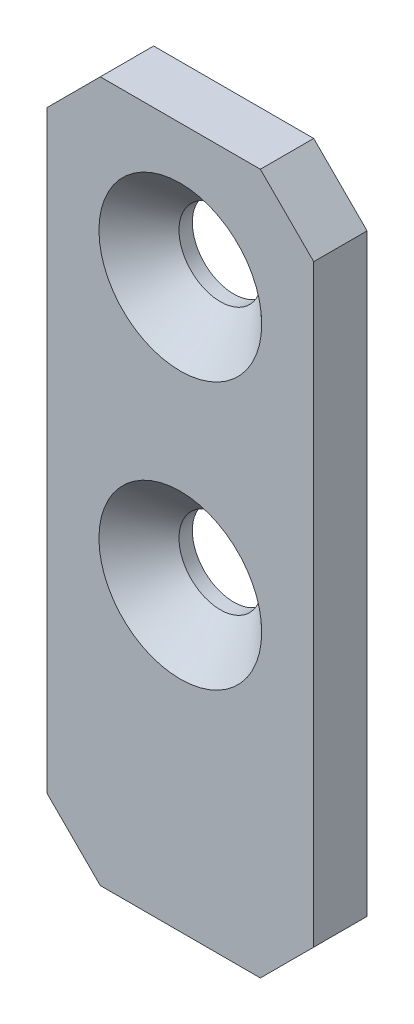
ISO-10303-21;
HEADER;
FILE_DESCRIPTION(('STEP AP214'),'2;1');
FILE_NAME('part.step','',(''),(''),'','','');
FILE_SCHEMA(('AUTOMOTIVE_DESIGN { 1 0 10303 214 1 1 1 1 }'));
ENDSEC;
DATA;
#1=APPLICATION_CONTEXT('core data for automotive mechanical design processes');
#2=APPLICATION_PROTOCOL_DEFINITION('international standard','automotive_design',2000,#1);
#3=PRODUCT_CONTEXT('',#1,'mechanical');
#4=PRODUCT('Part','Part','',(#3));
#5=PRODUCT_RELATED_PRODUCT_CATEGORY('part','',(#4));
#6=PRODUCT_DEFINITION_FORMATION('','',#4);
#7=PRODUCT_DEFINITION_CONTEXT('part definition',#1,'design');
#8=PRODUCT_DEFINITION('design','',#6,#7);
#9=PRODUCT_DEFINITION_SHAPE('','',#8);
#10=(LENGTH_UNIT() NAMED_UNIT(*) SI_UNIT(.MILLI.,.METRE.));
#11=(NAMED_UNIT(*) PLANE_ANGLE_UNIT() SI_UNIT($,.RADIAN.));
#12=(NAMED_UNIT(*) SI_UNIT($,.STERADIAN.) SOLID_ANGLE_UNIT());
#13=UNCERTAINTY_MEASURE_WITH_UNIT(LENGTH_MEASURE(1.E-05),#10,'distance_accuracy_value','');
#14=(GEOMETRIC_REPRESENTATION_CONTEXT(3) GLOBAL_UNCERTAINTY_ASSIGNED_CONTEXT((#13)) GLOBAL_UNIT_ASSIGNED_CONTEXT((#10,
#11,#12)) REPRESENTATION_CONTEXT('',''));
#15=CARTESIAN_POINT('',(0.,0.,0.));
#16=DIRECTION('',(0.,0.,1.));
#17=DIRECTION('',(1.,0.,0.));
#18=AXIS2_PLACEMENT_3D('',#15,#16,#17);
#19=CARTESIAN_POINT('',(0.,0.,2.));
#20=DIRECTION('',(0.,0.,1.));
#21=DIRECTION('',(1.,0.,0.));
#22=AXIS2_PLACEMENT_3D('',#19,#20,#21);
#23=PLANE('',#22);
#24=CARTESIAN_POINT('',(0.,16.25,2.));
#25=DIRECTION('',(0.,0.,1.));
#26=DIRECTION('',(1.,0.,0.));
#27=AXIS2_PLACEMENT_3D('',#24,#25,#26);
#28=CIRCLE('',#27,6.10000000000001);
#29=CARTESIAN_POINT('',(6.10000000000001,16.25,2.));
#30=VERTEX_POINT('',#29);
#31=EDGE_CURVE('E43',#30,#30,#28,.F.);
#32=ORIENTED_EDGE('',*,*,#31,.T.);
#33=EDGE_LOOP('',(#32));
#34=FACE_BOUND('',#33,.T.);
#35=CARTESIAN_POINT('',(0.,-3.75,2.));
#36=DIRECTION('',(0.,0.,1.));
#37=DIRECTION('',(1.,0.,0.));
#38=AXIS2_PLACEMENT_3D('',#35,#36,#37);
#39=CIRCLE('',#38,6.10000000000001);
#40=CARTESIAN_POINT('',(6.10000000000001,-3.75,2.));
#41=VERTEX_POINT('',#40);
#42=EDGE_CURVE('E172',#41,#41,#39,.F.);
#43=ORIENTED_EDGE('',*,*,#42,.T.);
#44=EDGE_LOOP('',(#43));
#45=FACE_BOUND('',#44,.T.);
#46=DIRECTION('',(-1.,0.,0.));
#47=VECTOR('',#46,1.);
#48=CARTESIAN_POINT('',(10.,26.25,2.));
#49=LINE('',#48,#47);
#50=CARTESIAN_POINT('',(6.,26.25,2.));
#51=VERTEX_POINT('',#50);
#52=CARTESIAN_POINT('',(-5.99999999999999,26.25,2.));
#53=VERTEX_POINT('',#52);
#54=EDGE_CURVE('E139',#51,#53,#49,.T.);
#55=ORIENTED_EDGE('',*,*,#54,.T.);
#56=DIRECTION('',(0.707106781186549,0.707106781186546,0.));
#57=VECTOR('',#56,1.);
#58=CARTESIAN_POINT('',(-16.125,16.125,2.));
#59=LINE('',#58,#57);
#60=CARTESIAN_POINT('',(-10.,22.25,2.));
#61=VERTEX_POINT('',#60);
#62=EDGE_CURVE('E158',#53,#61,#59,.F.);
#63=ORIENTED_EDGE('',*,*,#62,.T.);
#64=DIRECTION('',(0.,-1.,0.));
#65=VECTOR('',#64,1.);
#66=CARTESIAN_POINT('',(-10.,-26.25,2.));
#67=LINE('',#66,#65);
#68=CARTESIAN_POINT('',(-10.,-22.25,2.));
#69=VERTEX_POINT('',#68);
#70=EDGE_CURVE('E122',#61,#69,#67,.T.);
#71=ORIENTED_EDGE('',*,*,#70,.T.);
#72=DIRECTION('',(-0.707106781186546,0.707106781186549,0.));
#73=VECTOR('',#72,1.);
#74=CARTESIAN_POINT('',(-16.125,-16.125,2.));
#75=LINE('',#74,#73);
#76=CARTESIAN_POINT('',(-6.,-26.25,2.));
#77=VERTEX_POINT('',#76);
#78=EDGE_CURVE('E153',#69,#77,#75,.F.);
#79=ORIENTED_EDGE('',*,*,#78,.T.);
#80=DIRECTION('',(1.,0.,0.));
#81=VECTOR('',#80,1.);
#82=CARTESIAN_POINT('',(10.,-26.25,2.));
#83=LINE('',#82,#81);
#84=CARTESIAN_POINT('',(5.99999999999999,-26.25,2.));
#85=VERTEX_POINT('',#84);
#86=EDGE_CURVE('E201',#77,#85,#83,.T.);
#87=ORIENTED_EDGE('',*,*,#86,.T.);
#88=DIRECTION('',(-0.707106781186549,-0.707106781186546,0.));
#89=VECTOR('',#88,1.);
#90=CARTESIAN_POINT('',(16.125,-16.125,2.));
#91=LINE('',#90,#89);
#92=CARTESIAN_POINT('',(10.,-22.25,2.));
#93=VERTEX_POINT('',#92);
#94=EDGE_CURVE('E57',#85,#93,#91,.F.);
#95=ORIENTED_EDGE('',*,*,#94,.T.);
#96=DIRECTION('',(0.,1.,0.));
#97=VECTOR('',#96,1.);
#98=CARTESIAN_POINT('',(10.,-26.25,2.));
#99=LINE('',#98,#97);
#100=CARTESIAN_POINT('',(10.,22.25,2.));
#101=VERTEX_POINT('',#100);
#102=EDGE_CURVE('E202',#93,#101,#99,.T.);
#103=ORIENTED_EDGE('',*,*,#102,.T.);
#104=DIRECTION('',(0.707106781186546,-0.707106781186549,0.));
#105=VECTOR('',#104,1.);
#106=CARTESIAN_POINT('',(16.125,16.125,2.));
#107=LINE('',#106,#105);
#108=EDGE_CURVE('E156',#101,#51,#107,.F.);
#109=ORIENTED_EDGE('',*,*,#108,.T.);
#110=EDGE_LOOP('',(#55,#63,#71,#79,#87,#95,#103,#109));
#111=FACE_BOUND('',#110,.T.);
#112=ADVANCED_FACE('F34',(#34,#45,#111),#23,.T.);
#113=CARTESIAN_POINT('',(0.,0.,-2.));
#114=DIRECTION('',(0.,0.,1.));
#115=DIRECTION('',(1.,0.,0.));
#116=AXIS2_PLACEMENT_3D('',#113,#114,#115);
#117=PLANE('',#116);
#118=DIRECTION('',(0.,-1.,0.));
#119=VECTOR('',#118,1.);
#120=CARTESIAN_POINT('',(-10.,-26.25,-2.));
#121=LINE('',#120,#119);
#122=CARTESIAN_POINT('',(-10.,22.25,-2.));
#123=VERTEX_POINT('',#122);
#124=CARTESIAN_POINT('',(-10.,-22.25,-2.));
#125=VERTEX_POINT('',#124);
#126=EDGE_CURVE('E119',#123,#125,#121,.T.);
#127=ORIENTED_EDGE('',*,*,#126,.F.);
#128=DIRECTION('',(-0.707106781186549,-0.707106781186546,0.));
#129=VECTOR('',#128,1.);
#130=CARTESIAN_POINT('',(-10.,22.25,-2.));
#131=LINE('',#130,#129);
#132=CARTESIAN_POINT('',(-5.99999999999999,26.25,-2.));
#133=VERTEX_POINT('',#132);
#134=EDGE_CURVE('E102',#123,#133,#131,.F.);
#135=ORIENTED_EDGE('',*,*,#134,.T.);
#136=DIRECTION('',(-1.,0.,0.));
#137=VECTOR('',#136,1.);
#138=CARTESIAN_POINT('',(10.,26.25,-2.));
#139=LINE('',#138,#137);
#140=CARTESIAN_POINT('',(6.,26.25,-2.));
#141=VERTEX_POINT('',#140);
#142=EDGE_CURVE('E143',#141,#133,#139,.T.);
#143=ORIENTED_EDGE('',*,*,#142,.F.);
#144=DIRECTION('',(-0.707106781186546,0.707106781186549,0.));
#145=VECTOR('',#144,1.);
#146=CARTESIAN_POINT('',(6.,26.25,-2.));
#147=LINE('',#146,#145);
#148=CARTESIAN_POINT('',(10.,22.25,-2.));
#149=VERTEX_POINT('',#148);
#150=EDGE_CURVE('E113',#141,#149,#147,.F.);
#151=ORIENTED_EDGE('',*,*,#150,.T.);
#152=DIRECTION('',(0.,1.,0.));
#153=VECTOR('',#152,1.);
#154=CARTESIAN_POINT('',(10.,-26.25,-2.));
#155=LINE('',#154,#153);
#156=CARTESIAN_POINT('',(10.,-22.25,-2.));
#157=VERTEX_POINT('',#156);
#158=EDGE_CURVE('E133',#157,#149,#155,.T.);
#159=ORIENTED_EDGE('',*,*,#158,.F.);
#160=DIRECTION('',(0.707106781186549,0.707106781186546,0.));
#161=VECTOR('',#160,1.);
#162=CARTESIAN_POINT('',(10.,-22.25,-2.));
#163=LINE('',#162,#161);
#164=CARTESIAN_POINT('',(5.99999999999999,-26.25,-2.));
#165=VERTEX_POINT('',#164);
#166=EDGE_CURVE('E147',#157,#165,#163,.F.);
#167=ORIENTED_EDGE('',*,*,#166,.T.);
#168=DIRECTION('',(1.,0.,0.));
#169=VECTOR('',#168,1.);
#170=CARTESIAN_POINT('',(10.,-26.25,-2.));
#171=LINE('',#170,#169);
#172=CARTESIAN_POINT('',(-6.,-26.25,-2.));
#173=VERTEX_POINT('',#172);
#174=EDGE_CURVE('E129',#173,#165,#171,.T.);
#175=ORIENTED_EDGE('',*,*,#174,.F.);
#176=DIRECTION('',(0.707106781186546,-0.707106781186549,0.));
#177=VECTOR('',#176,1.);
#178=CARTESIAN_POINT('',(-6.,-26.25,-2.));
#179=LINE('',#178,#177);
#180=EDGE_CURVE('E123',#173,#125,#179,.F.);
#181=ORIENTED_EDGE('',*,*,#180,.T.);
#182=EDGE_LOOP('',(#127,#135,#143,#151,#159,#167,#175,#181));
#183=FACE_BOUND('',#182,.T.);
#184=CARTESIAN_POINT('',(0.,16.25,-2.));
#185=DIRECTION('',(0.,0.,1.));
#186=DIRECTION('',(1.,0.,0.));
#187=AXIS2_PLACEMENT_3D('',#184,#185,#186);
#188=CIRCLE('',#187,3.1);
#189=CARTESIAN_POINT('',(3.1,16.25,-2.));
#190=VERTEX_POINT('',#189);
#191=EDGE_CURVE('E130',#190,#190,#188,.T.);
#192=ORIENTED_EDGE('',*,*,#191,.T.);
#193=EDGE_LOOP('',(#192));
#194=FACE_BOUND('',#193,.T.);
#195=CARTESIAN_POINT('',(0.,-3.75,-2.));
#196=DIRECTION('',(0.,0.,1.));
#197=DIRECTION('',(1.,0.,0.));
#198=AXIS2_PLACEMENT_3D('',#195,#196,#197);
#199=CIRCLE('',#198,3.1);
#200=CARTESIAN_POINT('',(3.1,-3.75,-2.));
#201=VERTEX_POINT('',#200);
#202=EDGE_CURVE('E136',#201,#201,#199,.T.);
#203=ORIENTED_EDGE('',*,*,#202,.T.);
#204=EDGE_LOOP('',(#203));
#205=FACE_BOUND('',#204,.T.);
#206=ADVANCED_FACE('F126',(#183,#194,#205),#117,.F.);
#207=CARTESIAN_POINT('',(-10.,-26.25,2.));
#208=DIRECTION('',(1.,0.,0.));
#209=DIRECTION('',(0.,0.,-1.));
#210=AXIS2_PLACEMENT_3D('',#207,#208,#209);
#211=PLANE('',#210);
#212=ORIENTED_EDGE('',*,*,#70,.F.);
#213=DIRECTION('',(0.,0.,-1.));
#214=VECTOR('',#213,1.);
#215=CARTESIAN_POINT('',(-10.,22.25,2.));
#216=LINE('',#215,#214);
#217=EDGE_CURVE('E106',#61,#123,#216,.T.);
#218=ORIENTED_EDGE('',*,*,#217,.T.);
#219=ORIENTED_EDGE('',*,*,#126,.T.);
#220=DIRECTION('',(0.,0.,1.));
#221=VECTOR('',#220,1.);
#222=CARTESIAN_POINT('',(-10.,-22.25,2.));
#223=LINE('',#222,#221);
#224=EDGE_CURVE('E124',#125,#69,#223,.T.);
#225=ORIENTED_EDGE('',*,*,#224,.T.);
#226=EDGE_LOOP('',(#212,#218,#219,#225));
#227=FACE_BOUND('',#226,.T.);
#228=ADVANCED_FACE('F118',(#227),#211,.F.);
#229=CARTESIAN_POINT('',(10.,-26.25,2.));
#230=DIRECTION('',(0.,1.,0.));
#231=DIRECTION('',(-1.,0.,0.));
#232=AXIS2_PLACEMENT_3D('',#229,#230,#231);
#233=PLANE('',#232);
#234=ORIENTED_EDGE('',*,*,#174,.T.);
#235=DIRECTION('',(0.,0.,1.));
#236=VECTOR('',#235,1.);
#237=CARTESIAN_POINT('',(5.99999999999999,-26.25,2.));
#238=LINE('',#237,#236);
#239=EDGE_CURVE('E167',#165,#85,#238,.T.);
#240=ORIENTED_EDGE('',*,*,#239,.T.);
#241=ORIENTED_EDGE('',*,*,#86,.F.);
#242=DIRECTION('',(0.,0.,-1.));
#243=VECTOR('',#242,1.);
#244=CARTESIAN_POINT('',(-6.,-26.25,2.));
#245=LINE('',#244,#243);
#246=EDGE_CURVE('E164',#77,#173,#245,.T.);
#247=ORIENTED_EDGE('',*,*,#246,.T.);
#248=EDGE_LOOP('',(#234,#240,#241,#247));
#249=FACE_BOUND('',#248,.T.);
#250=ADVANCED_FACE('F217',(#249),#233,.F.);
#251=CARTESIAN_POINT('',(10.,-26.25,2.));
#252=DIRECTION('',(-1.,0.,0.));
#253=DIRECTION('',(0.,0.,1.));
#254=AXIS2_PLACEMENT_3D('',#251,#252,#253);
#255=PLANE('',#254);
#256=ORIENTED_EDGE('',*,*,#158,.T.);
#257=DIRECTION('',(0.,0.,1.));
#258=VECTOR('',#257,1.);
#259=CARTESIAN_POINT('',(10.,22.25,2.));
#260=LINE('',#259,#258);
#261=EDGE_CURVE('E50',#149,#101,#260,.T.);
#262=ORIENTED_EDGE('',*,*,#261,.T.);
#263=ORIENTED_EDGE('',*,*,#102,.F.);
#264=DIRECTION('',(0.,0.,-1.));
#265=VECTOR('',#264,1.);
#266=CARTESIAN_POINT('',(10.,-22.25,2.));
#267=LINE('',#266,#265);
#268=EDGE_CURVE('E160',#93,#157,#267,.T.);
#269=ORIENTED_EDGE('',*,*,#268,.T.);
#270=EDGE_LOOP('',(#256,#262,#263,#269));
#271=FACE_BOUND('',#270,.T.);
#272=ADVANCED_FACE('F211',(#271),#255,.F.);
#273=CARTESIAN_POINT('',(10.,26.25,2.));
#274=DIRECTION('',(0.,-1.,0.));
#275=DIRECTION('',(0.,0.,-1.));
#276=AXIS2_PLACEMENT_3D('',#273,#274,#275);
#277=PLANE('',#276);
#278=ORIENTED_EDGE('',*,*,#142,.T.);
#279=DIRECTION('',(0.,0.,1.));
#280=VECTOR('',#279,1.);
#281=CARTESIAN_POINT('',(-5.99999999999999,26.25,2.));
#282=LINE('',#281,#280);
#283=EDGE_CURVE('E107',#133,#53,#282,.T.);
#284=ORIENTED_EDGE('',*,*,#283,.T.);
#285=ORIENTED_EDGE('',*,*,#54,.F.);
#286=DIRECTION('',(0.,0.,-1.));
#287=VECTOR('',#286,1.);
#288=CARTESIAN_POINT('',(6.,26.25,2.));
#289=LINE('',#288,#287);
#290=EDGE_CURVE('E112',#51,#141,#289,.T.);
#291=ORIENTED_EDGE('',*,*,#290,.T.);
#292=EDGE_LOOP('',(#278,#284,#285,#291));
#293=FACE_BOUND('',#292,.T.);
#294=ADVANCED_FACE('F189',(#293),#277,.F.);
#295=CARTESIAN_POINT('',(0.,16.25,2.));
#296=DIRECTION('',(0.,0.,-1.));
#297=DIRECTION('',(-1.,0.,0.));
#298=AXIS2_PLACEMENT_3D('',#295,#296,#297);
#299=CYLINDRICAL_SURFACE('',#298,3.1);
#300=CARTESIAN_POINT('',(0.,16.25,-1.00000000000001));
#301=DIRECTION('',(0.,0.,1.));
#302=DIRECTION('',(1.,0.,0.));
#303=AXIS2_PLACEMENT_3D('',#300,#301,#302);
#304=CIRCLE('',#303,3.1);
#305=CARTESIAN_POINT('',(3.1,16.25,-1.00000000000001));
#306=VERTEX_POINT('',#305);
#307=EDGE_CURVE('E169',#306,#306,#304,.T.);
#308=ORIENTED_EDGE('',*,*,#307,.T.);
#309=EDGE_LOOP('',(#308));
#310=FACE_BOUND('',#309,.T.);
#311=ORIENTED_EDGE('',*,*,#191,.F.);
#312=EDGE_LOOP('',(#311));
#313=FACE_BOUND('',#312,.T.);
#314=ADVANCED_FACE('F185',(#310,#313),#299,.F.);
#315=CARTESIAN_POINT('',(0.,-3.75,2.));
#316=DIRECTION('',(0.,0.,-1.));
#317=DIRECTION('',(-1.,0.,0.));
#318=AXIS2_PLACEMENT_3D('',#315,#316,#317);
#319=CYLINDRICAL_SURFACE('',#318,3.1);
#320=CARTESIAN_POINT('',(0.,-3.75,-0.999999999999992));
#321=DIRECTION('',(0.,0.,1.));
#322=DIRECTION('',(1.,0.,0.));
#323=AXIS2_PLACEMENT_3D('',#320,#321,#322);
#324=CIRCLE('',#323,3.1);
#325=CARTESIAN_POINT('',(3.1,-3.75,-0.999999999999992));
#326=VERTEX_POINT('',#325);
#327=EDGE_CURVE('E11',#326,#326,#324,.T.);
#328=ORIENTED_EDGE('',*,*,#327,.T.);
#329=EDGE_LOOP('',(#328));
#330=FACE_BOUND('',#329,.T.);
#331=ORIENTED_EDGE('',*,*,#202,.F.);
#332=EDGE_LOOP('',(#331));
#333=FACE_BOUND('',#332,.T.);
#334=ADVANCED_FACE('F188',(#330,#333),#319,.F.);
#335=CARTESIAN_POINT('',(-10.,22.25,2.));
#336=DIRECTION('',(0.707106781186546,-0.707106781186549,0.));
#337=DIRECTION('',(0.,0.,-1.));
#338=AXIS2_PLACEMENT_3D('',#335,#336,#337);
#339=PLANE('',#338);
#340=ORIENTED_EDGE('',*,*,#62,.F.);
#341=ORIENTED_EDGE('',*,*,#283,.F.);
#342=ORIENTED_EDGE('',*,*,#134,.F.);
#343=ORIENTED_EDGE('',*,*,#217,.F.);
#344=EDGE_LOOP('',(#340,#341,#342,#343));
#345=FACE_BOUND('',#344,.T.);
#346=ADVANCED_FACE('F105',(#345),#339,.F.);
#347=CARTESIAN_POINT('',(6.,26.25,2.));
#348=DIRECTION('',(-0.707106781186549,-0.707106781186546,0.));
#349=DIRECTION('',(0.,0.,-1.));
#350=AXIS2_PLACEMENT_3D('',#347,#348,#349);
#351=PLANE('',#350);
#352=ORIENTED_EDGE('',*,*,#108,.F.);
#353=ORIENTED_EDGE('',*,*,#261,.F.);
#354=ORIENTED_EDGE('',*,*,#150,.F.);
#355=ORIENTED_EDGE('',*,*,#290,.F.);
#356=EDGE_LOOP('',(#352,#353,#354,#355));
#357=FACE_BOUND('',#356,.T.);
#358=ADVANCED_FACE('F209',(#357),#351,.F.);
#359=CARTESIAN_POINT('',(10.,-22.25,2.));
#360=DIRECTION('',(-0.707106781186546,0.707106781186549,0.));
#361=DIRECTION('',(0.,0.,-1.));
#362=AXIS2_PLACEMENT_3D('',#359,#360,#361);
#363=PLANE('',#362);
#364=ORIENTED_EDGE('',*,*,#94,.F.);
#365=ORIENTED_EDGE('',*,*,#239,.F.);
#366=ORIENTED_EDGE('',*,*,#166,.F.);
#367=ORIENTED_EDGE('',*,*,#268,.F.);
#368=EDGE_LOOP('',(#364,#365,#366,#367));
#369=FACE_BOUND('',#368,.T.);
#370=ADVANCED_FACE('F214',(#369),#363,.F.);
#371=CARTESIAN_POINT('',(-6.,-26.25,2.));
#372=DIRECTION('',(0.707106781186549,0.707106781186546,0.));
#373=DIRECTION('',(0.,0.,-1.));
#374=AXIS2_PLACEMENT_3D('',#371,#372,#373);
#375=PLANE('',#374);
#376=ORIENTED_EDGE('',*,*,#78,.F.);
#377=ORIENTED_EDGE('',*,*,#224,.F.);
#378=ORIENTED_EDGE('',*,*,#180,.F.);
#379=ORIENTED_EDGE('',*,*,#246,.F.);
#380=EDGE_LOOP('',(#376,#377,#378,#379));
#381=FACE_BOUND('',#380,.T.);
#382=ADVANCED_FACE('F182',(#381),#375,.F.);
#383=CARTESIAN_POINT('',(0.,16.25,-1.00000000000001));
#384=DIRECTION('',(0.,0.,1.));
#385=DIRECTION('',(1.,0.,0.));
#386=AXIS2_PLACEMENT_3D('',#383,#384,#385);
#387=CONICAL_SURFACE('',#386,3.1,0.78539816339745);
#388=ORIENTED_EDGE('',*,*,#31,.F.);
#389=EDGE_LOOP('',(#388));
#390=FACE_BOUND('',#389,.T.);
#391=ORIENTED_EDGE('',*,*,#307,.F.);
#392=EDGE_LOOP('',(#391));
#393=FACE_BOUND('',#392,.T.);
#394=ADVANCED_FACE('F179',(#390,#393),#387,.F.);
#395=CARTESIAN_POINT('',(0.,-3.75,-0.999999999999992));
#396=DIRECTION('',(0.,0.,1.));
#397=DIRECTION('',(1.,0.,0.));
#398=AXIS2_PLACEMENT_3D('',#395,#396,#397);
#399=CONICAL_SURFACE('',#398,3.1,0.785398163397451);
#400=ORIENTED_EDGE('',*,*,#42,.F.);
#401=EDGE_LOOP('',(#400));
#402=FACE_BOUND('',#401,.T.);
#403=ORIENTED_EDGE('',*,*,#327,.F.);
#404=EDGE_LOOP('',(#403));
#405=FACE_BOUND('',#404,.T.);
#406=ADVANCED_FACE('F37',(#402,#405),#399,.F.);
#407=CLOSED_SHELL('',(#112,#206,#228,#250,#272,#294,#314,#334,#346,#358,#370,#382,#394,#406));
#408=MANIFOLD_SOLID_BREP('B2',#407);
#409=ADVANCED_BREP_SHAPE_REPRESENTATION('',(#18,#408),#14);
#410=SHAPE_DEFINITION_REPRESENTATION(#9,#409);
ENDSEC;
END-ISO-10303-21;
